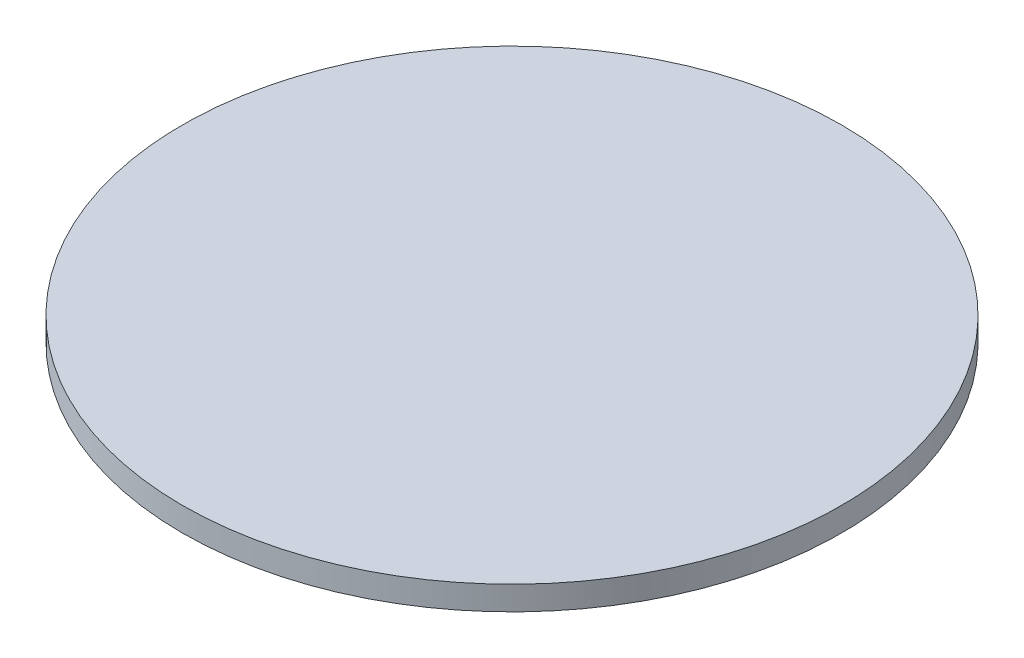
ISO-10303-21;
HEADER;
FILE_DESCRIPTION(('STEP AP214'),'2;1');
FILE_NAME('part.step','',(''),(''),'','','');
FILE_SCHEMA(('AUTOMOTIVE_DESIGN { 1 0 10303 214 1 1 1 1 }'));
ENDSEC;
DATA;
#1=APPLICATION_CONTEXT('core data for automotive mechanical design processes');
#2=APPLICATION_PROTOCOL_DEFINITION('international standard','automotive_design',2000,#1);
#3=PRODUCT_CONTEXT('',#1,'mechanical');
#4=PRODUCT('Part','Part','',(#3));
#5=PRODUCT_RELATED_PRODUCT_CATEGORY('part','',(#4));
#6=PRODUCT_DEFINITION_FORMATION('','',#4);
#7=PRODUCT_DEFINITION_CONTEXT('part definition',#1,'design');
#8=PRODUCT_DEFINITION('design','',#6,#7);
#9=PRODUCT_DEFINITION_SHAPE('','',#8);
#10=(LENGTH_UNIT() NAMED_UNIT(*) SI_UNIT(.MILLI.,.METRE.));
#11=(NAMED_UNIT(*) PLANE_ANGLE_UNIT() SI_UNIT($,.RADIAN.));
#12=(NAMED_UNIT(*) SI_UNIT($,.STERADIAN.) SOLID_ANGLE_UNIT());
#13=UNCERTAINTY_MEASURE_WITH_UNIT(LENGTH_MEASURE(1.E-05),#10,'distance_accuracy_value','');
#14=(GEOMETRIC_REPRESENTATION_CONTEXT(3) GLOBAL_UNCERTAINTY_ASSIGNED_CONTEXT((#13)) GLOBAL_UNIT_ASSIGNED_CONTEXT((#10,
#11,#12)) REPRESENTATION_CONTEXT('',''));
#15=CARTESIAN_POINT('',(0.,0.,0.));
#16=DIRECTION('',(0.,0.,1.));
#17=DIRECTION('',(1.,0.,0.));
#18=AXIS2_PLACEMENT_3D('',#15,#16,#17);
#19=CARTESIAN_POINT('',(0.,12.,0.));
#20=DIRECTION('',(0.,-1.,0.));
#21=DIRECTION('',(0.,0.,-1.));
#22=AXIS2_PLACEMENT_3D('',#19,#20,#21);
#23=CYLINDRICAL_SURFACE('',#22,165.);
#24=CARTESIAN_POINT('',(0.,12.,0.));
#25=DIRECTION('',(0.,1.,0.));
#26=DIRECTION('',(0.,0.,1.));
#27=AXIS2_PLACEMENT_3D('',#24,#25,#26);
#28=CIRCLE('',#27,165.);
#29=CARTESIAN_POINT('',(0.,12.,165.));
#30=VERTEX_POINT('',#29);
#31=EDGE_CURVE('E10',#30,#30,#28,.T.);
#32=ORIENTED_EDGE('',*,*,#31,.F.);
#33=EDGE_LOOP('',(#32));
#34=FACE_BOUND('',#33,.T.);
#35=CARTESIAN_POINT('',(0.,0.,0.));
#36=DIRECTION('',(0.,1.,0.));
#37=DIRECTION('',(0.,0.,1.));
#38=AXIS2_PLACEMENT_3D('',#35,#36,#37);
#39=CIRCLE('',#38,165.);
#40=CARTESIAN_POINT('',(0.,0.,165.));
#41=VERTEX_POINT('',#40);
#42=EDGE_CURVE('E46',#41,#41,#39,.T.);
#43=ORIENTED_EDGE('',*,*,#42,.T.);
#44=EDGE_LOOP('',(#43));
#45=FACE_BOUND('',#44,.T.);
#46=ADVANCED_FACE('F43',(#34,#45),#23,.T.);
#47=CARTESIAN_POINT('',(0.,12.,0.));
#48=DIRECTION('',(0.,1.,0.));
#49=DIRECTION('',(0.,0.,1.));
#50=AXIS2_PLACEMENT_3D('',#47,#48,#49);
#51=PLANE('',#50);
#52=ORIENTED_EDGE('',*,*,#31,.T.);
#53=EDGE_LOOP('',(#52));
#54=FACE_BOUND('',#53,.T.);
#55=ADVANCED_FACE('F91',(#54),#51,.T.);
#56=CARTESIAN_POINT('',(0.,0.,0.));
#57=DIRECTION('',(0.,1.,0.));
#58=DIRECTION('',(0.,0.,1.));
#59=AXIS2_PLACEMENT_3D('',#56,#57,#58);
#60=PLANE('',#59);
#61=CARTESIAN_POINT('',(0.,0.,0.));
#62=DIRECTION('',(0.,-1.,0.));
#63=DIRECTION('',(0.,0.,-1.));
#64=AXIS2_PLACEMENT_3D('',#61,#62,#63);
#65=CIRCLE('',#64,145.);
#66=CARTESIAN_POINT('',(0.,0.,-145.));
#67=VERTEX_POINT('',#66);
#68=EDGE_CURVE('E57',#67,#67,#65,.T.);
#69=ORIENTED_EDGE('',*,*,#68,.F.);
#70=EDGE_LOOP('',(#69));
#71=FACE_BOUND('',#70,.T.);
#72=ORIENTED_EDGE('',*,*,#42,.F.);
#73=EDGE_LOOP('',(#72));
#74=FACE_BOUND('',#73,.T.);
#75=ADVANCED_FACE('F85',(#71,#74),#60,.F.);
#76=CARTESIAN_POINT('',(0.,6.,0.));
#77=DIRECTION('',(0.,-1.,0.));
#78=DIRECTION('',(0.,0.,-1.));
#79=AXIS2_PLACEMENT_3D('',#76,#77,#78);
#80=CYLINDRICAL_SURFACE('',#79,145.);
#81=CARTESIAN_POINT('',(0.,6.,0.));
#82=DIRECTION('',(0.,-1.,0.));
#83=DIRECTION('',(0.,0.,-1.));
#84=AXIS2_PLACEMENT_3D('',#81,#82,#83);
#85=CIRCLE('',#84,145.);
#86=CARTESIAN_POINT('',(0.,6.,-145.));
#87=VERTEX_POINT('',#86);
#88=EDGE_CURVE('E55',#87,#87,#85,.T.);
#89=ORIENTED_EDGE('',*,*,#88,.F.);
#90=EDGE_LOOP('',(#89));
#91=FACE_BOUND('',#90,.T.);
#92=ORIENTED_EDGE('',*,*,#68,.T.);
#93=EDGE_LOOP('',(#92));
#94=FACE_BOUND('',#93,.T.);
#95=ADVANCED_FACE('F79',(#91,#94),#80,.F.);
#96=CARTESIAN_POINT('',(0.,6.,0.));
#97=DIRECTION('',(0.,-1.,0.));
#98=DIRECTION('',(0.,0.,-1.));
#99=AXIS2_PLACEMENT_3D('',#96,#97,#98);
#100=PLANE('',#99);
#101=CARTESIAN_POINT('',(0.,6.,0.));
#102=DIRECTION('',(0.,-1.,0.));
#103=DIRECTION('',(0.,0.,-1.));
#104=AXIS2_PLACEMENT_3D('',#101,#102,#103);
#105=CIRCLE('',#104,140.);
#106=CARTESIAN_POINT('',(0.,6.,-140.));
#107=VERTEX_POINT('',#106);
#108=EDGE_CURVE('E61',#107,#107,#105,.T.);
#109=ORIENTED_EDGE('',*,*,#108,.F.);
#110=EDGE_LOOP('',(#109));
#111=FACE_BOUND('',#110,.T.);
#112=ORIENTED_EDGE('',*,*,#88,.T.);
#113=EDGE_LOOP('',(#112));
#114=FACE_BOUND('',#113,.T.);
#115=ADVANCED_FACE('F76',(#111,#114),#100,.T.);
#116=CARTESIAN_POINT('',(0.,6.,0.));
#117=DIRECTION('',(0.,-1.,0.));
#118=DIRECTION('',(0.,0.,-1.));
#119=AXIS2_PLACEMENT_3D('',#116,#117,#118);
#120=CYLINDRICAL_SURFACE('',#119,140.);
#121=ORIENTED_EDGE('',*,*,#108,.T.);
#122=EDGE_LOOP('',(#121));
#123=FACE_BOUND('',#122,.T.);
#124=CARTESIAN_POINT('',(0.,0.,0.));
#125=DIRECTION('',(0.,-1.,0.));
#126=DIRECTION('',(0.,0.,-1.));
#127=AXIS2_PLACEMENT_3D('',#124,#125,#126);
#128=CIRCLE('',#127,140.);
#129=CARTESIAN_POINT('',(0.,0.,-140.));
#130=VERTEX_POINT('',#129);
#131=EDGE_CURVE('E65',#130,#130,#128,.T.);
#132=ORIENTED_EDGE('',*,*,#131,.F.);
#133=EDGE_LOOP('',(#132));
#134=FACE_BOUND('',#133,.T.);
#135=ADVANCED_FACE('F73',(#123,#134),#120,.T.);
#136=ORIENTED_EDGE('',*,*,#131,.T.);
#137=EDGE_LOOP('',(#136));
#138=FACE_BOUND('',#137,.T.);
#139=ADVANCED_FACE('F92',(#138),#60,.F.);
#140=CLOSED_SHELL('',(#46,#55,#75,#95,#115,#135,#139));
#141=MANIFOLD_SOLID_BREP('B2',#140);
#142=ADVANCED_BREP_SHAPE_REPRESENTATION('',(#18,#141),#14);
#143=SHAPE_DEFINITION_REPRESENTATION(#9,#142);
ENDSEC;
END-ISO-10303-21;
